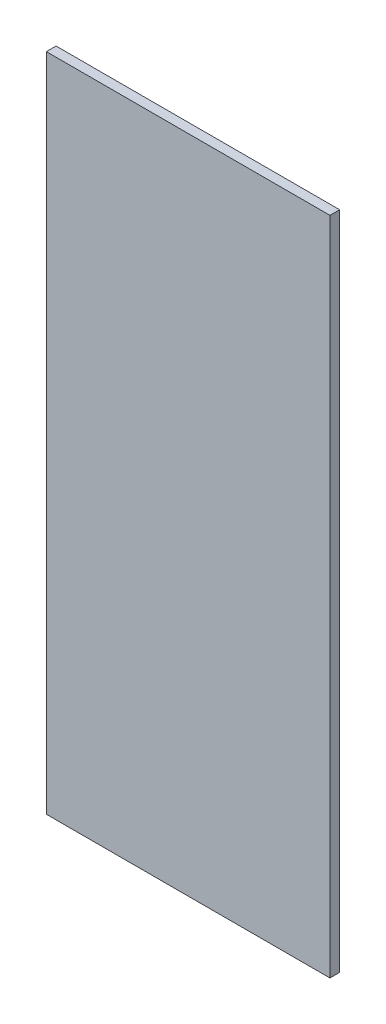
ISO-10303-21;
HEADER;
FILE_DESCRIPTION(('STEP AP214'),'2;1');
FILE_NAME('part.step','',(''),(''),'','','');
FILE_SCHEMA(('AUTOMOTIVE_DESIGN { 1 0 10303 214 1 1 1 1 }'));
ENDSEC;
DATA;
#1=APPLICATION_CONTEXT('core data for automotive mechanical design processes');
#2=APPLICATION_PROTOCOL_DEFINITION('international standard','automotive_design',2000,#1);
#3=PRODUCT_CONTEXT('',#1,'mechanical');
#4=PRODUCT('Part','Part','',(#3));
#5=PRODUCT_RELATED_PRODUCT_CATEGORY('part','',(#4));
#6=PRODUCT_DEFINITION_FORMATION('','',#4);
#7=PRODUCT_DEFINITION_CONTEXT('part definition',#1,'design');
#8=PRODUCT_DEFINITION('design','',#6,#7);
#9=PRODUCT_DEFINITION_SHAPE('','',#8);
#10=(LENGTH_UNIT() NAMED_UNIT(*) SI_UNIT(.MILLI.,.METRE.));
#11=(NAMED_UNIT(*) PLANE_ANGLE_UNIT() SI_UNIT($,.RADIAN.));
#12=(NAMED_UNIT(*) SI_UNIT($,.STERADIAN.) SOLID_ANGLE_UNIT());
#13=UNCERTAINTY_MEASURE_WITH_UNIT(LENGTH_MEASURE(1.E-05),#10,'distance_accuracy_value','');
#14=(GEOMETRIC_REPRESENTATION_CONTEXT(3) GLOBAL_UNCERTAINTY_ASSIGNED_CONTEXT((#13)) GLOBAL_UNIT_ASSIGNED_CONTEXT((#10,
#11,#12)) REPRESENTATION_CONTEXT('',''));
#15=CARTESIAN_POINT('',(0.,0.,0.));
#16=DIRECTION('',(0.,0.,1.));
#17=DIRECTION('',(1.,0.,0.));
#18=AXIS2_PLACEMENT_3D('',#15,#16,#17);
#19=CARTESIAN_POINT('',(73.,-170.,2.5));
#20=DIRECTION('',(-1.,0.,0.));
#21=DIRECTION('',(0.,0.,1.));
#22=AXIS2_PLACEMENT_3D('',#19,#20,#21);
#23=PLANE('',#22);
#24=DIRECTION('',(0.,1.,0.));
#25=VECTOR('',#24,1.);
#26=CARTESIAN_POINT('',(73.,-170.,-2.5));
#27=LINE('',#26,#25);
#28=CARTESIAN_POINT('',(73.,-170.,-2.5));
#29=VERTEX_POINT('',#28);
#30=CARTESIAN_POINT('',(73.,170.,-2.5));
#31=VERTEX_POINT('',#30);
#32=EDGE_CURVE('E95',#29,#31,#27,.T.);
#33=ORIENTED_EDGE('',*,*,#32,.T.);
#34=DIRECTION('',(0.,0.,-1.));
#35=VECTOR('',#34,1.);
#36=CARTESIAN_POINT('',(73.,170.,2.5));
#37=LINE('',#36,#35);
#38=CARTESIAN_POINT('',(73.,170.,2.5));
#39=VERTEX_POINT('',#38);
#40=EDGE_CURVE('E11',#39,#31,#37,.T.);
#41=ORIENTED_EDGE('',*,*,#40,.F.);
#42=DIRECTION('',(0.,1.,0.));
#43=VECTOR('',#42,1.);
#44=CARTESIAN_POINT('',(73.,-170.,2.5));
#45=LINE('',#44,#43);
#46=CARTESIAN_POINT('',(73.,-170.,2.5));
#47=VERTEX_POINT('',#46);
#48=EDGE_CURVE('E83',#47,#39,#45,.T.);
#49=ORIENTED_EDGE('',*,*,#48,.F.);
#50=DIRECTION('',(0.,0.,-1.));
#51=VECTOR('',#50,1.);
#52=CARTESIAN_POINT('',(73.,-170.,2.5));
#53=LINE('',#52,#51);
#54=EDGE_CURVE('E91',#47,#29,#53,.T.);
#55=ORIENTED_EDGE('',*,*,#54,.T.);
#56=EDGE_LOOP('',(#33,#41,#49,#55));
#57=FACE_BOUND('',#56,.T.);
#58=ADVANCED_FACE('F32',(#57),#23,.F.);
#59=CARTESIAN_POINT('',(-73.,170.,2.5));
#60=DIRECTION('',(0.,-1.,0.));
#61=DIRECTION('',(0.,0.,-1.));
#62=AXIS2_PLACEMENT_3D('',#59,#60,#61);
#63=PLANE('',#62);
#64=DIRECTION('',(-1.,0.,0.));
#65=VECTOR('',#64,1.);
#66=CARTESIAN_POINT('',(-73.,170.,-2.5));
#67=LINE('',#66,#65);
#68=CARTESIAN_POINT('',(-73.,170.,-2.5));
#69=VERTEX_POINT('',#68);
#70=EDGE_CURVE('E87',#31,#69,#67,.T.);
#71=ORIENTED_EDGE('',*,*,#70,.T.);
#72=DIRECTION('',(0.,0.,-1.));
#73=VECTOR('',#72,1.);
#74=CARTESIAN_POINT('',(-73.,170.,2.5));
#75=LINE('',#74,#73);
#76=CARTESIAN_POINT('',(-73.,170.,2.5));
#77=VERTEX_POINT('',#76);
#78=EDGE_CURVE('E40',#77,#69,#75,.T.);
#79=ORIENTED_EDGE('',*,*,#78,.F.);
#80=DIRECTION('',(-1.,0.,0.));
#81=VECTOR('',#80,1.);
#82=CARTESIAN_POINT('',(-73.,170.,2.5));
#83=LINE('',#82,#81);
#84=EDGE_CURVE('E78',#39,#77,#83,.T.);
#85=ORIENTED_EDGE('',*,*,#84,.F.);
#86=ORIENTED_EDGE('',*,*,#40,.T.);
#87=EDGE_LOOP('',(#71,#79,#85,#86));
#88=FACE_BOUND('',#87,.T.);
#89=ADVANCED_FACE('F86',(#88),#63,.F.);
#90=CARTESIAN_POINT('',(-73.,-170.,2.5));
#91=DIRECTION('',(1.,0.,0.));
#92=DIRECTION('',(0.,0.,-1.));
#93=AXIS2_PLACEMENT_3D('',#90,#91,#92);
#94=PLANE('',#93);
#95=DIRECTION('',(0.,-1.,0.));
#96=VECTOR('',#95,1.);
#97=CARTESIAN_POINT('',(-73.,-170.,-2.5));
#98=LINE('',#97,#96);
#99=CARTESIAN_POINT('',(-73.,-170.,-2.5));
#100=VERTEX_POINT('',#99);
#101=EDGE_CURVE('E65',#69,#100,#98,.T.);
#102=ORIENTED_EDGE('',*,*,#101,.T.);
#103=DIRECTION('',(0.,0.,-1.));
#104=VECTOR('',#103,1.);
#105=CARTESIAN_POINT('',(-73.,-170.,2.5));
#106=LINE('',#105,#104);
#107=CARTESIAN_POINT('',(-73.,-170.,2.5));
#108=VERTEX_POINT('',#107);
#109=EDGE_CURVE('E88',#108,#100,#106,.T.);
#110=ORIENTED_EDGE('',*,*,#109,.F.);
#111=DIRECTION('',(0.,-1.,0.));
#112=VECTOR('',#111,1.);
#113=CARTESIAN_POINT('',(-73.,-170.,2.5));
#114=LINE('',#113,#112);
#115=EDGE_CURVE('E81',#77,#108,#114,.T.);
#116=ORIENTED_EDGE('',*,*,#115,.F.);
#117=ORIENTED_EDGE('',*,*,#78,.T.);
#118=EDGE_LOOP('',(#102,#110,#116,#117));
#119=FACE_BOUND('',#118,.T.);
#120=ADVANCED_FACE('F89',(#119),#94,.F.);
#121=CARTESIAN_POINT('',(-73.,-170.,2.5));
#122=DIRECTION('',(0.,1.,0.));
#123=DIRECTION('',(0.,0.,1.));
#124=AXIS2_PLACEMENT_3D('',#121,#122,#123);
#125=PLANE('',#124);
#126=DIRECTION('',(1.,0.,0.));
#127=VECTOR('',#126,1.);
#128=CARTESIAN_POINT('',(-73.,-170.,-2.5));
#129=LINE('',#128,#127);
#130=EDGE_CURVE('E71',#100,#29,#129,.T.);
#131=ORIENTED_EDGE('',*,*,#130,.T.);
#132=ORIENTED_EDGE('',*,*,#54,.F.);
#133=DIRECTION('',(1.,0.,0.));
#134=VECTOR('',#133,1.);
#135=CARTESIAN_POINT('',(-73.,-170.,2.5));
#136=LINE('',#135,#134);
#137=EDGE_CURVE('E48',#108,#47,#136,.T.);
#138=ORIENTED_EDGE('',*,*,#137,.F.);
#139=ORIENTED_EDGE('',*,*,#109,.T.);
#140=EDGE_LOOP('',(#131,#132,#138,#139));
#141=FACE_BOUND('',#140,.T.);
#142=ADVANCED_FACE('F102',(#141),#125,.F.);
#143=CARTESIAN_POINT('',(0.,0.,2.5));
#144=DIRECTION('',(0.,0.,-1.));
#145=DIRECTION('',(-1.,0.,0.));
#146=AXIS2_PLACEMENT_3D('',#143,#144,#145);
#147=PLANE('',#146);
#148=ORIENTED_EDGE('',*,*,#48,.T.);
#149=ORIENTED_EDGE('',*,*,#84,.T.);
#150=ORIENTED_EDGE('',*,*,#115,.T.);
#151=ORIENTED_EDGE('',*,*,#137,.T.);
#152=EDGE_LOOP('',(#148,#149,#150,#151));
#153=FACE_BOUND('',#152,.T.);
#154=ADVANCED_FACE('F79',(#153),#147,.F.);
#155=CARTESIAN_POINT('',(0.,0.,-2.5));
#156=DIRECTION('',(0.,0.,-1.));
#157=DIRECTION('',(-1.,0.,0.));
#158=AXIS2_PLACEMENT_3D('',#155,#156,#157);
#159=PLANE('',#158);
#160=ORIENTED_EDGE('',*,*,#32,.F.);
#161=ORIENTED_EDGE('',*,*,#130,.F.);
#162=ORIENTED_EDGE('',*,*,#101,.F.);
#163=ORIENTED_EDGE('',*,*,#70,.F.);
#164=EDGE_LOOP('',(#160,#161,#162,#163));
#165=FACE_BOUND('',#164,.T.);
#166=ADVANCED_FACE('F105',(#165),#159,.T.);
#167=CLOSED_SHELL('',(#58,#89,#120,#142,#154,#166));
#168=MANIFOLD_SOLID_BREP('B2',#167);
#169=ADVANCED_BREP_SHAPE_REPRESENTATION('',(#18,#168),#14);
#170=SHAPE_DEFINITION_REPRESENTATION(#9,#169);
ENDSEC;
END-ISO-10303-21;
